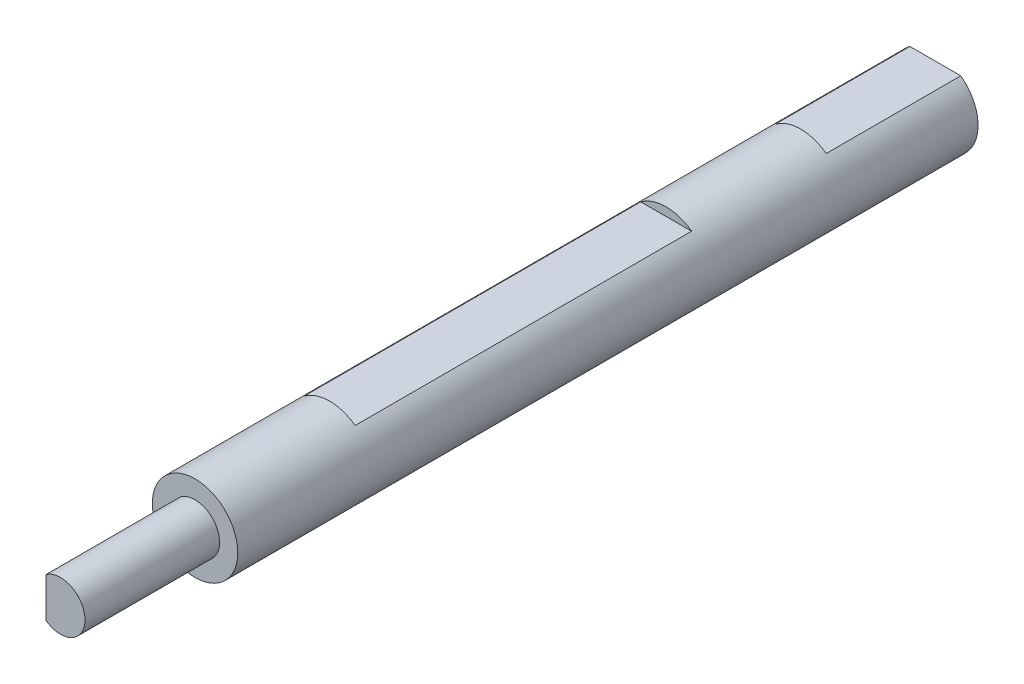
ISO-10303-21;
HEADER;
FILE_DESCRIPTION(('STEP AP214'),'2;1');
FILE_NAME('part.step','',(''),(''),'','','');
FILE_SCHEMA(('AUTOMOTIVE_DESIGN { 1 0 10303 214 1 1 1 1 }'));
ENDSEC;
DATA;
#1=APPLICATION_CONTEXT('core data for automotive mechanical design processes');
#2=APPLICATION_PROTOCOL_DEFINITION('international standard','automotive_design',2000,#1);
#3=PRODUCT_CONTEXT('',#1,'mechanical');
#4=PRODUCT('Part','Part','',(#3));
#5=PRODUCT_RELATED_PRODUCT_CATEGORY('part','',(#4));
#6=PRODUCT_DEFINITION_FORMATION('','',#4);
#7=PRODUCT_DEFINITION_CONTEXT('part definition',#1,'design');
#8=PRODUCT_DEFINITION('design','',#6,#7);
#9=PRODUCT_DEFINITION_SHAPE('','',#8);
#10=(LENGTH_UNIT() NAMED_UNIT(*) SI_UNIT(.MILLI.,.METRE.));
#11=(NAMED_UNIT(*) PLANE_ANGLE_UNIT() SI_UNIT($,.RADIAN.));
#12=(NAMED_UNIT(*) SI_UNIT($,.STERADIAN.) SOLID_ANGLE_UNIT());
#13=UNCERTAINTY_MEASURE_WITH_UNIT(LENGTH_MEASURE(1.E-05),#10,'distance_accuracy_value','');
#14=(GEOMETRIC_REPRESENTATION_CONTEXT(3) GLOBAL_UNCERTAINTY_ASSIGNED_CONTEXT((#13)) GLOBAL_UNIT_ASSIGNED_CONTEXT((#10,
#11,#12)) REPRESENTATION_CONTEXT('',''));
#15=CARTESIAN_POINT('',(0.,0.,0.));
#16=DIRECTION('',(0.,0.,1.));
#17=DIRECTION('',(1.,0.,0.));
#18=AXIS2_PLACEMENT_3D('',#15,#16,#17);
#19=CARTESIAN_POINT('',(0.,0.,65.));
#20=DIRECTION('',(0.,0.,-1.));
#21=DIRECTION('',(-1.,0.,0.));
#22=AXIS2_PLACEMENT_3D('',#19,#20,#21);
#23=CYLINDRICAL_SURFACE('',#22,3.175);
#24=CARTESIAN_POINT('',(0.,0.,45.));
#25=DIRECTION('',(0.,0.,-1.));
#26=DIRECTION('',(-1.,0.,0.));
#27=AXIS2_PLACEMENT_3D('',#24,#25,#26);
#28=CIRCLE('',#27,3.175);
#29=CARTESIAN_POINT('',(-1.8915932438027,2.55,45.));
#30=VERTEX_POINT('',#29);
#31=CARTESIAN_POINT('',(1.8915932438027,2.55,45.));
#32=VERTEX_POINT('',#31);
#33=EDGE_CURVE('E121',#30,#32,#28,.T.);
#34=ORIENTED_EDGE('',*,*,#33,.F.);
#35=DIRECTION('',(0.,0.,-1.));
#36=VECTOR('',#35,1.);
#37=CARTESIAN_POINT('',(-1.8915932438027,2.55,45.));
#38=LINE('',#37,#36);
#39=CARTESIAN_POINT('',(-1.8915932438027,2.55,20.));
#40=VERTEX_POINT('',#39);
#41=EDGE_CURVE('E130',#30,#40,#38,.T.);
#42=ORIENTED_EDGE('',*,*,#41,.T.);
#43=CARTESIAN_POINT('',(0.,0.,20.));
#44=DIRECTION('',(0.,0.,-1.));
#45=DIRECTION('',(-1.,0.,0.));
#46=AXIS2_PLACEMENT_3D('',#43,#44,#45);
#47=CIRCLE('',#46,3.175);
#48=CARTESIAN_POINT('',(1.8915932438027,2.55,20.));
#49=VERTEX_POINT('',#48);
#50=EDGE_CURVE('E120',#40,#49,#47,.T.);
#51=ORIENTED_EDGE('',*,*,#50,.T.);
#52=DIRECTION('',(0.,0.,-1.));
#53=VECTOR('',#52,1.);
#54=CARTESIAN_POINT('',(1.8915932438027,2.55,45.));
#55=LINE('',#54,#53);
#56=EDGE_CURVE('E126',#32,#49,#55,.T.);
#57=ORIENTED_EDGE('',*,*,#56,.F.);
#58=EDGE_LOOP('',(#34,#42,#51,#57));
#59=FACE_BOUND('',#58,.T.);
#60=CARTESIAN_POINT('',(0.,0.,10.));
#61=DIRECTION('',(0.,0.,-1.));
#62=DIRECTION('',(-1.,0.,0.));
#63=AXIS2_PLACEMENT_3D('',#60,#61,#62);
#64=CIRCLE('',#63,3.175);
#65=CARTESIAN_POINT('',(-1.89159324380269,2.55,10.));
#66=VERTEX_POINT('',#65);
#67=CARTESIAN_POINT('',(1.8915932438027,2.55,10.));
#68=VERTEX_POINT('',#67);
#69=EDGE_CURVE('E135',#66,#68,#64,.T.);
#70=ORIENTED_EDGE('',*,*,#69,.F.);
#71=DIRECTION('',(0.,0.,-1.));
#72=VECTOR('',#71,1.);
#73=CARTESIAN_POINT('',(-1.89159324380269,2.55,10.));
#74=LINE('',#73,#72);
#75=CARTESIAN_POINT('',(-1.89159324380269,2.55,0.));
#76=VERTEX_POINT('',#75);
#77=EDGE_CURVE('E144',#66,#76,#74,.T.);
#78=ORIENTED_EDGE('',*,*,#77,.T.);
#79=CARTESIAN_POINT('',(0.,0.,0.));
#80=DIRECTION('',(0.,0.,1.));
#81=DIRECTION('',(1.,0.,0.));
#82=AXIS2_PLACEMENT_3D('',#79,#80,#81);
#83=CIRCLE('',#82,3.175);
#84=CARTESIAN_POINT('',(-1.89159324380269,-2.55,0.));
#85=VERTEX_POINT('',#84);
#86=EDGE_CURVE('E11',#76,#85,#83,.T.);
#87=ORIENTED_EDGE('',*,*,#86,.T.);
#88=DIRECTION('',(0.,0.,-1.));
#89=VECTOR('',#88,1.);
#90=CARTESIAN_POINT('',(-1.89159324380269,-2.55,10.));
#91=LINE('',#90,#89);
#92=CARTESIAN_POINT('',(-1.89159324380269,-2.55,10.));
#93=VERTEX_POINT('',#92);
#94=EDGE_CURVE('E153',#93,#85,#91,.T.);
#95=ORIENTED_EDGE('',*,*,#94,.F.);
#96=CARTESIAN_POINT('',(0.,0.,10.));
#97=DIRECTION('',(0.,0.,-1.));
#98=DIRECTION('',(-1.,0.,0.));
#99=AXIS2_PLACEMENT_3D('',#96,#97,#98);
#100=CIRCLE('',#99,3.175);
#101=CARTESIAN_POINT('',(1.89159324380269,-2.55,10.));
#102=VERTEX_POINT('',#101);
#103=EDGE_CURVE('E148',#102,#93,#100,.T.);
#104=ORIENTED_EDGE('',*,*,#103,.F.);
#105=DIRECTION('',(0.,0.,-1.));
#106=VECTOR('',#105,1.);
#107=CARTESIAN_POINT('',(1.89159324380269,-2.55,10.));
#108=LINE('',#107,#106);
#109=CARTESIAN_POINT('',(1.89159324380269,-2.55,0.));
#110=VERTEX_POINT('',#109);
#111=EDGE_CURVE('E143',#102,#110,#108,.T.);
#112=ORIENTED_EDGE('',*,*,#111,.T.);
#113=CARTESIAN_POINT('',(1.8915932438027,2.55,0.));
#114=VERTEX_POINT('',#113);
#115=EDGE_CURVE('E35',#110,#114,#83,.T.);
#116=ORIENTED_EDGE('',*,*,#115,.T.);
#117=DIRECTION('',(0.,0.,-1.));
#118=VECTOR('',#117,1.);
#119=CARTESIAN_POINT('',(1.8915932438027,2.55,10.));
#120=LINE('',#119,#118);
#121=EDGE_CURVE('E141',#68,#114,#120,.T.);
#122=ORIENTED_EDGE('',*,*,#121,.F.);
#123=EDGE_LOOP('',(#70,#78,#87,#95,#104,#112,#116,#122));
#124=FACE_BOUND('',#123,.T.);
#125=CARTESIAN_POINT('',(0.,0.,55.));
#126=DIRECTION('',(0.,0.,1.));
#127=DIRECTION('',(1.,0.,0.));
#128=AXIS2_PLACEMENT_3D('',#125,#126,#127);
#129=CIRCLE('',#128,3.175);
#130=CARTESIAN_POINT('',(3.175,0.,55.));
#131=VERTEX_POINT('',#130);
#132=EDGE_CURVE('E116',#131,#131,#129,.T.);
#133=ORIENTED_EDGE('',*,*,#132,.F.);
#134=EDGE_LOOP('',(#133));
#135=FACE_BOUND('',#134,.T.);
#136=ADVANCED_FACE('F32',(#59,#124,#135),#23,.T.);
#137=CARTESIAN_POINT('',(0.,0.,0.));
#138=DIRECTION('',(0.,0.,1.));
#139=DIRECTION('',(1.,0.,0.));
#140=AXIS2_PLACEMENT_3D('',#137,#138,#139);
#141=PLANE('',#140);
#142=ORIENTED_EDGE('',*,*,#86,.F.);
#143=DIRECTION('',(-1.,0.,0.));
#144=VECTOR('',#143,1.);
#145=CARTESIAN_POINT('',(1.8915932438027,2.55,0.));
#146=LINE('',#145,#144);
#147=EDGE_CURVE('E138',#114,#76,#146,.T.);
#148=ORIENTED_EDGE('',*,*,#147,.F.);
#149=ORIENTED_EDGE('',*,*,#115,.F.);
#150=DIRECTION('',(1.,0.,0.));
#151=VECTOR('',#150,1.);
#152=CARTESIAN_POINT('',(1.89159324380269,-2.55,0.));
#153=LINE('',#152,#151);
#154=EDGE_CURVE('E133',#85,#110,#153,.T.);
#155=ORIENTED_EDGE('',*,*,#154,.F.);
#156=EDGE_LOOP('',(#142,#148,#149,#155));
#157=FACE_BOUND('',#156,.T.);
#158=ADVANCED_FACE('F166',(#157),#141,.F.);
#159=CARTESIAN_POINT('',(1.89159324380269,-2.55,10.));
#160=DIRECTION('',(0.,1.,0.));
#161=DIRECTION('',(0.,0.,1.));
#162=AXIS2_PLACEMENT_3D('',#159,#160,#161);
#163=PLANE('',#162);
#164=ORIENTED_EDGE('',*,*,#154,.T.);
#165=ORIENTED_EDGE('',*,*,#111,.F.);
#166=DIRECTION('',(1.,0.,0.));
#167=VECTOR('',#166,1.);
#168=CARTESIAN_POINT('',(1.89159324380269,-2.55,10.));
#169=LINE('',#168,#167);
#170=EDGE_CURVE('E150',#93,#102,#169,.T.);
#171=ORIENTED_EDGE('',*,*,#170,.F.);
#172=ORIENTED_EDGE('',*,*,#94,.T.);
#173=EDGE_LOOP('',(#164,#165,#171,#172));
#174=FACE_BOUND('',#173,.T.);
#175=ADVANCED_FACE('F160',(#174),#163,.F.);
#176=CARTESIAN_POINT('',(0.,0.,10.));
#177=DIRECTION('',(0.,0.,-1.));
#178=DIRECTION('',(-1.,0.,0.));
#179=AXIS2_PLACEMENT_3D('',#176,#177,#178);
#180=PLANE('',#179);
#181=ORIENTED_EDGE('',*,*,#103,.T.);
#182=ORIENTED_EDGE('',*,*,#170,.T.);
#183=EDGE_LOOP('',(#181,#182));
#184=FACE_BOUND('',#183,.T.);
#185=ADVANCED_FACE('F187',(#184),#180,.T.);
#186=CARTESIAN_POINT('',(1.8915932438027,2.55,10.));
#187=DIRECTION('',(0.,-1.,0.));
#188=DIRECTION('',(1.,0.,0.));
#189=AXIS2_PLACEMENT_3D('',#186,#187,#188);
#190=PLANE('',#189);
#191=ORIENTED_EDGE('',*,*,#147,.T.);
#192=ORIENTED_EDGE('',*,*,#77,.F.);
#193=DIRECTION('',(-1.,0.,0.));
#194=VECTOR('',#193,1.);
#195=CARTESIAN_POINT('',(1.8915932438027,2.55,10.));
#196=LINE('',#195,#194);
#197=EDGE_CURVE('E137',#68,#66,#196,.T.);
#198=ORIENTED_EDGE('',*,*,#197,.F.);
#199=ORIENTED_EDGE('',*,*,#121,.T.);
#200=EDGE_LOOP('',(#191,#192,#198,#199));
#201=FACE_BOUND('',#200,.T.);
#202=ADVANCED_FACE('F174',(#201),#190,.F.);
#203=CARTESIAN_POINT('',(0.,0.,10.));
#204=DIRECTION('',(0.,0.,-1.));
#205=DIRECTION('',(-1.,0.,0.));
#206=AXIS2_PLACEMENT_3D('',#203,#204,#205);
#207=PLANE('',#206);
#208=ORIENTED_EDGE('',*,*,#69,.T.);
#209=ORIENTED_EDGE('',*,*,#197,.T.);
#210=EDGE_LOOP('',(#208,#209));
#211=FACE_BOUND('',#210,.T.);
#212=ADVANCED_FACE('F176',(#211),#207,.T.);
#213=CARTESIAN_POINT('',(1.8915932438027,2.55,45.));
#214=DIRECTION('',(0.,-1.,0.));
#215=DIRECTION('',(0.,0.,-1.));
#216=AXIS2_PLACEMENT_3D('',#213,#214,#215);
#217=PLANE('',#216);
#218=DIRECTION('',(-1.,0.,0.));
#219=VECTOR('',#218,1.);
#220=CARTESIAN_POINT('',(1.8915932438027,2.55,20.));
#221=LINE('',#220,#219);
#222=EDGE_CURVE('E53',#49,#40,#221,.T.);
#223=ORIENTED_EDGE('',*,*,#222,.T.);
#224=ORIENTED_EDGE('',*,*,#41,.F.);
#225=DIRECTION('',(-1.,0.,0.));
#226=VECTOR('',#225,1.);
#227=CARTESIAN_POINT('',(1.8915932438027,2.55,45.));
#228=LINE('',#227,#226);
#229=EDGE_CURVE('E123',#32,#30,#228,.T.);
#230=ORIENTED_EDGE('',*,*,#229,.F.);
#231=ORIENTED_EDGE('',*,*,#56,.T.);
#232=EDGE_LOOP('',(#223,#224,#230,#231));
#233=FACE_BOUND('',#232,.T.);
#234=ADVANCED_FACE('F178',(#233),#217,.F.);
#235=CARTESIAN_POINT('',(0.,0.,45.));
#236=DIRECTION('',(0.,0.,-1.));
#237=DIRECTION('',(-1.,0.,0.));
#238=AXIS2_PLACEMENT_3D('',#235,#236,#237);
#239=PLANE('',#238);
#240=ORIENTED_EDGE('',*,*,#33,.T.);
#241=ORIENTED_EDGE('',*,*,#229,.T.);
#242=EDGE_LOOP('',(#240,#241));
#243=FACE_BOUND('',#242,.T.);
#244=ADVANCED_FACE('F184',(#243),#239,.T.);
#245=CARTESIAN_POINT('',(0.,0.,20.));
#246=DIRECTION('',(0.,0.,-1.));
#247=DIRECTION('',(-1.,0.,0.));
#248=AXIS2_PLACEMENT_3D('',#245,#246,#247);
#249=PLANE('',#248);
#250=ORIENTED_EDGE('',*,*,#50,.F.);
#251=ORIENTED_EDGE('',*,*,#222,.F.);
#252=EDGE_LOOP('',(#250,#251));
#253=FACE_BOUND('',#252,.T.);
#254=ADVANCED_FACE('F198',(#253),#249,.F.);
#255=CARTESIAN_POINT('',(0.,0.,55.));
#256=DIRECTION('',(0.,0.,1.));
#257=DIRECTION('',(1.,0.,0.));
#258=AXIS2_PLACEMENT_3D('',#255,#256,#257);
#259=PLANE('',#258);
#260=DIRECTION('',(0.,-1.,0.));
#261=VECTOR('',#260,1.);
#262=CARTESIAN_POINT('',(-1.073,-1.47871565894191,55.));
#263=LINE('',#262,#261);
#264=CARTESIAN_POINT('',(-1.073,1.47871565894191,55.));
#265=VERTEX_POINT('',#264);
#266=CARTESIAN_POINT('',(-1.073,-1.47871565894191,55.));
#267=VERTEX_POINT('',#266);
#268=EDGE_CURVE('E100',#265,#267,#263,.T.);
#269=ORIENTED_EDGE('',*,*,#268,.F.);
#270=CARTESIAN_POINT('',(0.,0.,55.));
#271=DIRECTION('',(0.,0.,1.));
#272=DIRECTION('',(1.,0.,0.));
#273=AXIS2_PLACEMENT_3D('',#270,#271,#272);
#274=CIRCLE('',#273,1.827);
#275=EDGE_CURVE('E109',#267,#265,#274,.T.);
#276=ORIENTED_EDGE('',*,*,#275,.F.);
#277=EDGE_LOOP('',(#269,#276));
#278=FACE_BOUND('',#277,.T.);
#279=ORIENTED_EDGE('',*,*,#132,.T.);
#280=EDGE_LOOP('',(#279));
#281=FACE_BOUND('',#280,.T.);
#282=ADVANCED_FACE('F107',(#278,#281),#259,.T.);
#283=CARTESIAN_POINT('',(0.,0.,55.));
#284=DIRECTION('',(0.,0.,1.));
#285=DIRECTION('',(1.,0.,0.));
#286=AXIS2_PLACEMENT_3D('',#283,#284,#285);
#287=CYLINDRICAL_SURFACE('',#286,1.827);
#288=CARTESIAN_POINT('',(0.,0.,65.));
#289=DIRECTION('',(0.,0.,1.));
#290=DIRECTION('',(1.,0.,0.));
#291=AXIS2_PLACEMENT_3D('',#288,#289,#290);
#292=CIRCLE('',#291,1.827);
#293=CARTESIAN_POINT('',(-1.073,-1.47871565894191,65.));
#294=VERTEX_POINT('',#293);
#295=CARTESIAN_POINT('',(-1.073,1.47871565894191,65.));
#296=VERTEX_POINT('',#295);
#297=EDGE_CURVE('E46',#294,#296,#292,.T.);
#298=ORIENTED_EDGE('',*,*,#297,.F.);
#299=DIRECTION('',(0.,0.,1.));
#300=VECTOR('',#299,1.);
#301=CARTESIAN_POINT('',(-1.073,-1.47871565894191,55.));
#302=LINE('',#301,#300);
#303=EDGE_CURVE('E104',#267,#294,#302,.T.);
#304=ORIENTED_EDGE('',*,*,#303,.F.);
#305=ORIENTED_EDGE('',*,*,#275,.T.);
#306=DIRECTION('',(0.,0.,1.));
#307=VECTOR('',#306,1.);
#308=CARTESIAN_POINT('',(-1.073,1.47871565894191,55.));
#309=LINE('',#308,#307);
#310=EDGE_CURVE('E97',#265,#296,#309,.T.);
#311=ORIENTED_EDGE('',*,*,#310,.T.);
#312=EDGE_LOOP('',(#298,#304,#305,#311));
#313=FACE_BOUND('',#312,.T.);
#314=ADVANCED_FACE('F111',(#313),#287,.T.);
#315=CARTESIAN_POINT('',(-1.073,-1.47871565894191,55.));
#316=DIRECTION('',(-1.,0.,0.));
#317=DIRECTION('',(0.,0.,1.));
#318=AXIS2_PLACEMENT_3D('',#315,#316,#317);
#319=PLANE('',#318);
#320=DIRECTION('',(0.,-1.,0.));
#321=VECTOR('',#320,1.);
#322=CARTESIAN_POINT('',(-1.073,-1.47871565894191,65.));
#323=LINE('',#322,#321);
#324=EDGE_CURVE('E102',#296,#294,#323,.T.);
#325=ORIENTED_EDGE('',*,*,#324,.F.);
#326=ORIENTED_EDGE('',*,*,#310,.F.);
#327=ORIENTED_EDGE('',*,*,#268,.T.);
#328=ORIENTED_EDGE('',*,*,#303,.T.);
#329=EDGE_LOOP('',(#325,#326,#327,#328));
#330=FACE_BOUND('',#329,.T.);
#331=ADVANCED_FACE('F99',(#330),#319,.T.);
#332=CARTESIAN_POINT('',(0.,0.,65.));
#333=DIRECTION('',(0.,0.,1.));
#334=DIRECTION('',(1.,0.,0.));
#335=AXIS2_PLACEMENT_3D('',#332,#333,#334);
#336=PLANE('',#335);
#337=ORIENTED_EDGE('',*,*,#324,.T.);
#338=ORIENTED_EDGE('',*,*,#297,.T.);
#339=EDGE_LOOP('',(#337,#338));
#340=FACE_BOUND('',#339,.T.);
#341=ADVANCED_FACE('F211',(#340),#336,.T.);
#342=CLOSED_SHELL('',(#136,#158,#175,#185,#202,#212,#234,#244,#254,#282,#314,#331,#341));
#343=MANIFOLD_SOLID_BREP('B2',#342);
#344=ADVANCED_BREP_SHAPE_REPRESENTATION('',(#18,#343),#14);
#345=SHAPE_DEFINITION_REPRESENTATION(#9,#344);
ENDSEC;
END-ISO-10303-21;
